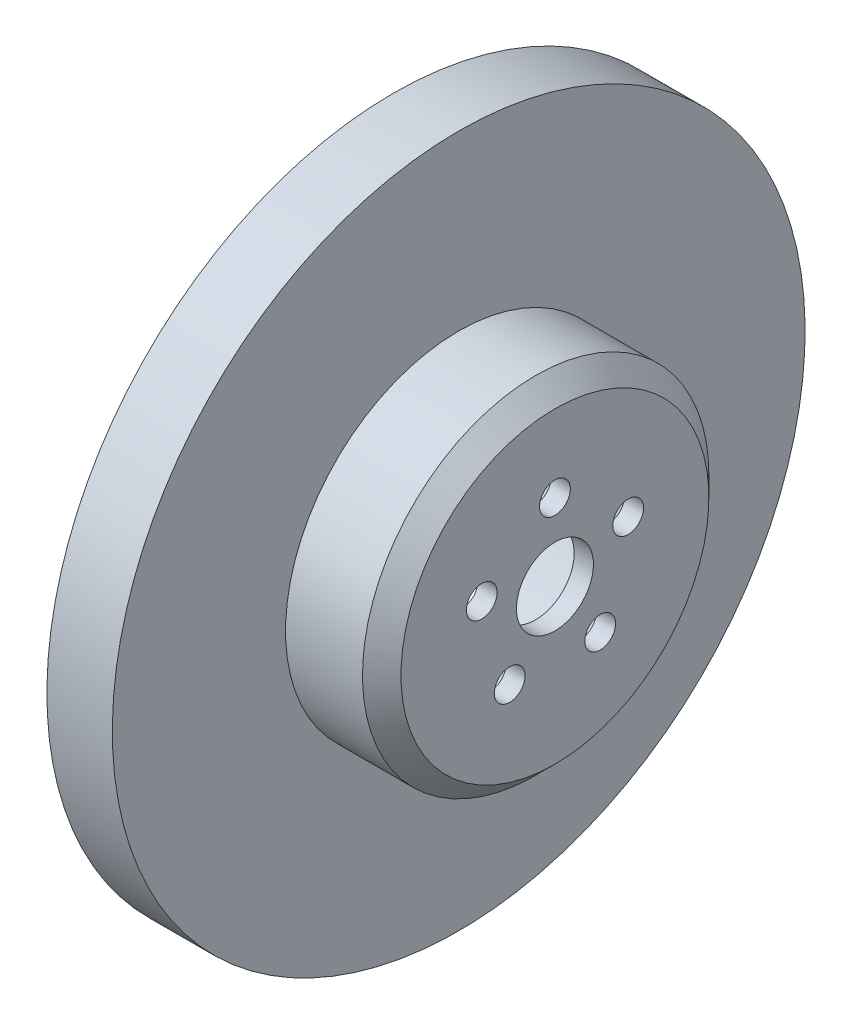
ISO-10303-21;
HEADER;
FILE_DESCRIPTION(('STEP AP214'),'2;1');
FILE_NAME('part.step','',(''),(''),'','','');
FILE_SCHEMA(('AUTOMOTIVE_DESIGN { 1 0 10303 214 1 1 1 1 }'));
ENDSEC;
DATA;
#1=APPLICATION_CONTEXT('core data for automotive mechanical design processes');
#2=APPLICATION_PROTOCOL_DEFINITION('international standard','automotive_design',2000,#1);
#3=PRODUCT_CONTEXT('',#1,'mechanical');
#4=PRODUCT('Part','Part','',(#3));
#5=PRODUCT_RELATED_PRODUCT_CATEGORY('part','',(#4));
#6=PRODUCT_DEFINITION_FORMATION('','',#4);
#7=PRODUCT_DEFINITION_CONTEXT('part definition',#1,'design');
#8=PRODUCT_DEFINITION('design','',#6,#7);
#9=PRODUCT_DEFINITION_SHAPE('','',#8);
#10=(LENGTH_UNIT() NAMED_UNIT(*) SI_UNIT(.MILLI.,.METRE.));
#11=(NAMED_UNIT(*) PLANE_ANGLE_UNIT() SI_UNIT($,.RADIAN.));
#12=(NAMED_UNIT(*) SI_UNIT($,.STERADIAN.) SOLID_ANGLE_UNIT());
#13=UNCERTAINTY_MEASURE_WITH_UNIT(LENGTH_MEASURE(1.E-05),#10,'distance_accuracy_value','');
#14=(GEOMETRIC_REPRESENTATION_CONTEXT(3) GLOBAL_UNCERTAINTY_ASSIGNED_CONTEXT((#13)) GLOBAL_UNIT_ASSIGNED_CONTEXT((#10,
#11,#12)) REPRESENTATION_CONTEXT('',''));
#15=CARTESIAN_POINT('',(0.,0.,0.));
#16=DIRECTION('',(0.,0.,1.));
#17=DIRECTION('',(1.,0.,0.));
#18=AXIS2_PLACEMENT_3D('',#15,#16,#17);
#19=CARTESIAN_POINT('',(50.,-20.,0.));
#20=DIRECTION('',(1.,0.,0.));
#21=DIRECTION('',(0.,1.,0.));
#22=AXIS2_PLACEMENT_3D('',#19,#20,#21);
#23=CYLINDRICAL_SURFACE('',#22,20.);
#24=CARTESIAN_POINT('',(0.,-20.,0.));
#25=DIRECTION('',(1.,0.,0.));
#26=DIRECTION('',(0.,1.,0.));
#27=AXIS2_PLACEMENT_3D('',#24,#25,#26);
#28=CIRCLE('',#27,20.);
#29=CARTESIAN_POINT('',(0.,0.,0.));
#30=VERTEX_POINT('',#29);
#31=EDGE_CURVE('E42',#30,#30,#28,.T.);
#32=ORIENTED_EDGE('',*,*,#31,.T.);
#33=EDGE_LOOP('',(#32));
#34=FACE_BOUND('',#33,.T.);
#35=CARTESIAN_POINT('',(-10.,-20.,0.));
#36=DIRECTION('',(1.,0.,0.));
#37=DIRECTION('',(0.,1.,0.));
#38=AXIS2_PLACEMENT_3D('',#35,#36,#37);
#39=CIRCLE('',#38,20.);
#40=CARTESIAN_POINT('',(-10.,0.,0.));
#41=VERTEX_POINT('',#40);
#42=EDGE_CURVE('E68',#41,#41,#39,.T.);
#43=ORIENTED_EDGE('',*,*,#42,.F.);
#44=EDGE_LOOP('',(#43));
#45=FACE_BOUND('',#44,.T.);
#46=ADVANCED_FACE('F31',(#34,#45),#23,.F.);
#47=CARTESIAN_POINT('',(0.,0.,0.));
#48=DIRECTION('',(1.,0.,0.));
#49=DIRECTION('',(0.,1.,0.));
#50=AXIS2_PLACEMENT_3D('',#47,#48,#49);
#51=PLANE('',#50);
#52=CARTESIAN_POINT('',(0.,-20.,0.));
#53=DIRECTION('',(1.,0.,0.));
#54=DIRECTION('',(0.,1.,0.));
#55=AXIS2_PLACEMENT_3D('',#52,#53,#54);
#56=CIRCLE('',#55,80.0000000000001);
#57=CARTESIAN_POINT('',(0.,60.0000000000001,0.));
#58=VERTEX_POINT('',#57);
#59=EDGE_CURVE('E38',#58,#58,#56,.T.);
#60=ORIENTED_EDGE('',*,*,#59,.T.);
#61=EDGE_LOOP('',(#60));
#62=FACE_BOUND('',#61,.T.);
#63=CARTESIAN_POINT('',(0.,-7.63932022500167,-38.042260651806));
#64=DIRECTION('',(1.,0.,0.));
#65=DIRECTION('',(0.,0.309016994374958,-0.95105651629515));
#66=AXIS2_PLACEMENT_3D('',#63,#64,#65);
#67=CIRCLE('',#66,8.);
#68=CARTESIAN_POINT('',(0.,-5.16718427000201,-45.6507127821672));
#69=VERTEX_POINT('',#68);
#70=EDGE_CURVE('E53',#69,#69,#67,.T.);
#71=ORIENTED_EDGE('',*,*,#70,.F.);
#72=EDGE_LOOP('',(#71));
#73=FACE_BOUND('',#72,.T.);
#74=CARTESIAN_POINT('',(0.,-52.3606797749977,-23.5114100916992));
#75=DIRECTION('',(1.,0.,0.));
#76=DIRECTION('',(0.,-0.809016994374942,-0.58778525229248));
#77=AXIS2_PLACEMENT_3D('',#74,#75,#76);
#78=CIRCLE('',#77,8.);
#79=CARTESIAN_POINT('',(0.,-58.8328157299972,-28.2136921100391));
#80=VERTEX_POINT('',#79);
#81=EDGE_CURVE('E52',#80,#80,#78,.T.);
#82=ORIENTED_EDGE('',*,*,#81,.F.);
#83=EDGE_LOOP('',(#82));
#84=FACE_BOUND('',#83,.T.);
#85=CARTESIAN_POINT('',(0.,-52.360679774998,23.5114100916987));
#86=DIRECTION('',(1.,0.,0.));
#87=DIRECTION('',(0.,-0.809016994374951,0.587785252292469));
#88=AXIS2_PLACEMENT_3D('',#85,#86,#87);
#89=CIRCLE('',#88,8.);
#90=CARTESIAN_POINT('',(0.,-58.8328157299976,28.2136921100385));
#91=VERTEX_POINT('',#90);
#92=EDGE_CURVE('E57',#91,#91,#89,.T.);
#93=ORIENTED_EDGE('',*,*,#92,.F.);
#94=EDGE_LOOP('',(#93));
#95=FACE_BOUND('',#94,.T.);
#96=CARTESIAN_POINT('',(0.,-7.63932022500221,38.0422606518062));
#97=DIRECTION('',(1.,0.,0.));
#98=DIRECTION('',(0.,0.309016994374945,0.951056516295155));
#99=AXIS2_PLACEMENT_3D('',#96,#97,#98);
#100=CIRCLE('',#99,8.);
#101=CARTESIAN_POINT('',(0.,-5.16718427000266,45.6507127821674));
#102=VERTEX_POINT('',#101);
#103=EDGE_CURVE('E61',#102,#102,#100,.T.);
#104=ORIENTED_EDGE('',*,*,#103,.F.);
#105=EDGE_LOOP('',(#104));
#106=FACE_BOUND('',#105,.T.);
#107=CARTESIAN_POINT('',(0.,20.,0.));
#108=DIRECTION('',(1.,0.,0.));
#109=DIRECTION('',(0.,1.,0.));
#110=AXIS2_PLACEMENT_3D('',#107,#108,#109);
#111=CIRCLE('',#110,8.);
#112=CARTESIAN_POINT('',(0.,28.,0.));
#113=VERTEX_POINT('',#112);
#114=EDGE_CURVE('E65',#113,#113,#111,.T.);
#115=ORIENTED_EDGE('',*,*,#114,.F.);
#116=EDGE_LOOP('',(#115));
#117=FACE_BOUND('',#116,.T.);
#118=ORIENTED_EDGE('',*,*,#31,.F.);
#119=EDGE_LOOP('',(#118));
#120=FACE_BOUND('',#119,.T.);
#121=ADVANCED_FACE('F99',(#62,#73,#84,#95,#106,#117,#120),#51,.T.);
#122=CARTESIAN_POINT('',(50.,-20.,0.));
#123=DIRECTION('',(1.,0.,0.));
#124=DIRECTION('',(0.,1.,0.));
#125=AXIS2_PLACEMENT_3D('',#122,#123,#124);
#126=CYLINDRICAL_SURFACE('',#125,90.);
#127=CARTESIAN_POINT('',(-9.99999999999998,-20.,0.));
#128=DIRECTION('',(1.,0.,0.));
#129=DIRECTION('',(0.,0.,-1.));
#130=AXIS2_PLACEMENT_3D('',#127,#128,#129);
#131=CIRCLE('',#130,90.);
#132=CARTESIAN_POINT('',(-9.99999999999998,-20.,-90.));
#133=VERTEX_POINT('',#132);
#134=EDGE_CURVE('E10',#133,#133,#131,.F.);
#135=ORIENTED_EDGE('',*,*,#134,.T.);
#136=EDGE_LOOP('',(#135));
#137=FACE_BOUND('',#136,.T.);
#138=CARTESIAN_POINT('',(-50.,-20.,0.));
#139=DIRECTION('',(1.,0.,0.));
#140=DIRECTION('',(0.,1.,0.));
#141=AXIS2_PLACEMENT_3D('',#138,#139,#140);
#142=CIRCLE('',#141,90.);
#143=CARTESIAN_POINT('',(-50.,70.,0.));
#144=VERTEX_POINT('',#143);
#145=EDGE_CURVE('E46',#144,#144,#142,.T.);
#146=ORIENTED_EDGE('',*,*,#145,.T.);
#147=EDGE_LOOP('',(#146));
#148=FACE_BOUND('',#147,.T.);
#149=ADVANCED_FACE('F102',(#137,#148),#126,.T.);
#150=CARTESIAN_POINT('',(-50.,70.,0.));
#151=DIRECTION('',(1.,0.,0.));
#152=DIRECTION('',(0.,1.,0.));
#153=AXIS2_PLACEMENT_3D('',#150,#151,#152);
#154=PLANE('',#153);
#155=CARTESIAN_POINT('',(-50.,-20.,0.));
#156=DIRECTION('',(1.,0.,0.));
#157=DIRECTION('',(0.,1.,0.));
#158=AXIS2_PLACEMENT_3D('',#155,#156,#157);
#159=CIRCLE('',#158,180.);
#160=CARTESIAN_POINT('',(-50.,160.,0.));
#161=VERTEX_POINT('',#160);
#162=EDGE_CURVE('E72',#161,#161,#159,.T.);
#163=ORIENTED_EDGE('',*,*,#162,.T.);
#164=EDGE_LOOP('',(#163));
#165=FACE_BOUND('',#164,.T.);
#166=ORIENTED_EDGE('',*,*,#145,.F.);
#167=EDGE_LOOP('',(#166));
#168=FACE_BOUND('',#167,.T.);
#169=ADVANCED_FACE('F141',(#165,#168),#154,.T.);
#170=CARTESIAN_POINT('',(50.,-20.,0.));
#171=DIRECTION('',(1.,0.,0.));
#172=DIRECTION('',(0.,1.,0.));
#173=AXIS2_PLACEMENT_3D('',#170,#171,#172);
#174=CYLINDRICAL_SURFACE('',#173,180.);
#175=CARTESIAN_POINT('',(-84.,-20.,0.));
#176=DIRECTION('',(1.,0.,0.));
#177=DIRECTION('',(0.,1.,0.));
#178=AXIS2_PLACEMENT_3D('',#175,#176,#177);
#179=CIRCLE('',#178,180.);
#180=CARTESIAN_POINT('',(-84.,160.,0.));
#181=VERTEX_POINT('',#180);
#182=EDGE_CURVE('E75',#181,#181,#179,.T.);
#183=ORIENTED_EDGE('',*,*,#182,.T.);
#184=EDGE_LOOP('',(#183));
#185=FACE_BOUND('',#184,.T.);
#186=ORIENTED_EDGE('',*,*,#162,.F.);
#187=EDGE_LOOP('',(#186));
#188=FACE_BOUND('',#187,.T.);
#189=ADVANCED_FACE('F135',(#185,#188),#174,.T.);
#190=CARTESIAN_POINT('',(-84.,160.,0.));
#191=DIRECTION('',(-1.,0.,0.));
#192=DIRECTION('',(0.,-1.,0.));
#193=AXIS2_PLACEMENT_3D('',#190,#191,#192);
#194=PLANE('',#193);
#195=CARTESIAN_POINT('',(-84.,-20.,0.));
#196=DIRECTION('',(1.,0.,0.));
#197=DIRECTION('',(0.,1.,0.));
#198=AXIS2_PLACEMENT_3D('',#195,#196,#197);
#199=CIRCLE('',#198,80.);
#200=CARTESIAN_POINT('',(-84.,60.,0.));
#201=VERTEX_POINT('',#200);
#202=EDGE_CURVE('E78',#201,#201,#199,.T.);
#203=ORIENTED_EDGE('',*,*,#202,.T.);
#204=EDGE_LOOP('',(#203));
#205=FACE_BOUND('',#204,.T.);
#206=ORIENTED_EDGE('',*,*,#182,.F.);
#207=EDGE_LOOP('',(#206));
#208=FACE_BOUND('',#207,.T.);
#209=ADVANCED_FACE('F129',(#205,#208),#194,.T.);
#210=CARTESIAN_POINT('',(50.,-20.,0.));
#211=DIRECTION('',(1.,0.,0.));
#212=DIRECTION('',(0.,1.,0.));
#213=AXIS2_PLACEMENT_3D('',#210,#211,#212);
#214=CYLINDRICAL_SURFACE('',#213,80.);
#215=CARTESIAN_POINT('',(-10.,-20.,0.));
#216=DIRECTION('',(1.,0.,0.));
#217=DIRECTION('',(0.,1.,0.));
#218=AXIS2_PLACEMENT_3D('',#215,#216,#217);
#219=CIRCLE('',#218,80.);
#220=CARTESIAN_POINT('',(-10.,60.,0.));
#221=VERTEX_POINT('',#220);
#222=EDGE_CURVE('E81',#221,#221,#219,.T.);
#223=ORIENTED_EDGE('',*,*,#222,.T.);
#224=EDGE_LOOP('',(#223));
#225=FACE_BOUND('',#224,.T.);
#226=ORIENTED_EDGE('',*,*,#202,.F.);
#227=EDGE_LOOP('',(#226));
#228=FACE_BOUND('',#227,.T.);
#229=ADVANCED_FACE('F122',(#225,#228),#214,.F.);
#230=CARTESIAN_POINT('',(-10.,60.,0.));
#231=DIRECTION('',(-1.,0.,0.));
#232=DIRECTION('',(0.,-1.,0.));
#233=AXIS2_PLACEMENT_3D('',#230,#231,#232);
#234=PLANE('',#233);
#235=CARTESIAN_POINT('',(-9.99999999999999,-7.63932022500168,-38.042260651806));
#236=DIRECTION('',(-1.,0.,0.));
#237=DIRECTION('',(0.,-1.,0.));
#238=AXIS2_PLACEMENT_3D('',#235,#236,#237);
#239=CIRCLE('',#238,8.);
#240=CARTESIAN_POINT('',(-9.99999999999999,-15.6393202250017,-38.042260651806));
#241=VERTEX_POINT('',#240);
#242=EDGE_CURVE('E49',#241,#241,#239,.T.);
#243=ORIENTED_EDGE('',*,*,#242,.F.);
#244=EDGE_LOOP('',(#243));
#245=FACE_BOUND('',#244,.T.);
#246=CARTESIAN_POINT('',(-9.99999999999999,-52.3606797749977,-23.5114100916992));
#247=DIRECTION('',(-1.,0.,0.));
#248=DIRECTION('',(0.,-1.,0.));
#249=AXIS2_PLACEMENT_3D('',#246,#247,#248);
#250=CIRCLE('',#249,8.);
#251=CARTESIAN_POINT('',(-9.99999999999999,-60.3606797749977,-23.5114100916992));
#252=VERTEX_POINT('',#251);
#253=EDGE_CURVE('E54',#252,#252,#250,.T.);
#254=ORIENTED_EDGE('',*,*,#253,.F.);
#255=EDGE_LOOP('',(#254));
#256=FACE_BOUND('',#255,.T.);
#257=CARTESIAN_POINT('',(-9.99999999999999,-52.360679774998,23.5114100916987));
#258=DIRECTION('',(-1.,0.,0.));
#259=DIRECTION('',(0.,-1.,0.));
#260=AXIS2_PLACEMENT_3D('',#257,#258,#259);
#261=CIRCLE('',#260,8.);
#262=CARTESIAN_POINT('',(-9.99999999999999,-60.360679774998,23.5114100916987));
#263=VERTEX_POINT('',#262);
#264=EDGE_CURVE('E58',#263,#263,#261,.T.);
#265=ORIENTED_EDGE('',*,*,#264,.F.);
#266=EDGE_LOOP('',(#265));
#267=FACE_BOUND('',#266,.T.);
#268=CARTESIAN_POINT('',(-9.99999999999999,-7.63932022500222,38.0422606518062));
#269=DIRECTION('',(-1.,0.,0.));
#270=DIRECTION('',(0.,-1.,0.));
#271=AXIS2_PLACEMENT_3D('',#268,#269,#270);
#272=CIRCLE('',#271,8.);
#273=CARTESIAN_POINT('',(-9.99999999999999,-15.6393202250022,38.0422606518062));
#274=VERTEX_POINT('',#273);
#275=EDGE_CURVE('E62',#274,#274,#272,.T.);
#276=ORIENTED_EDGE('',*,*,#275,.F.);
#277=EDGE_LOOP('',(#276));
#278=FACE_BOUND('',#277,.T.);
#279=CARTESIAN_POINT('',(-10.,20.,0.));
#280=DIRECTION('',(-1.,0.,0.));
#281=DIRECTION('',(0.,-1.,0.));
#282=AXIS2_PLACEMENT_3D('',#279,#280,#281);
#283=CIRCLE('',#282,8.);
#284=CARTESIAN_POINT('',(-10.,12.,0.));
#285=VERTEX_POINT('',#284);
#286=EDGE_CURVE('E66',#285,#285,#283,.T.);
#287=ORIENTED_EDGE('',*,*,#286,.F.);
#288=EDGE_LOOP('',(#287));
#289=FACE_BOUND('',#288,.T.);
#290=ORIENTED_EDGE('',*,*,#42,.T.);
#291=EDGE_LOOP('',(#290));
#292=FACE_BOUND('',#291,.T.);
#293=ORIENTED_EDGE('',*,*,#222,.F.);
#294=EDGE_LOOP('',(#293));
#295=FACE_BOUND('',#294,.T.);
#296=ADVANCED_FACE('F118',(#245,#256,#267,#278,#289,#292,#295),#234,.T.);
#297=CARTESIAN_POINT('',(-84.,20.,0.));
#298=DIRECTION('',(1.,0.,0.));
#299=DIRECTION('',(0.,1.,0.));
#300=AXIS2_PLACEMENT_3D('',#297,#298,#299);
#301=CYLINDRICAL_SURFACE('',#300,8.);
#302=ORIENTED_EDGE('',*,*,#286,.T.);
#303=EDGE_LOOP('',(#302));
#304=FACE_BOUND('',#303,.T.);
#305=ORIENTED_EDGE('',*,*,#114,.T.);
#306=EDGE_LOOP('',(#305));
#307=FACE_BOUND('',#306,.T.);
#308=ADVANCED_FACE('F121',(#304,#307),#301,.F.);
#309=CARTESIAN_POINT('',(-84.,-7.63932022500223,38.0422606518062));
#310=DIRECTION('',(1.,0.,0.));
#311=DIRECTION('',(0.,1.,0.));
#312=AXIS2_PLACEMENT_3D('',#309,#310,#311);
#313=CYLINDRICAL_SURFACE('',#312,8.);
#314=ORIENTED_EDGE('',*,*,#275,.T.);
#315=EDGE_LOOP('',(#314));
#316=FACE_BOUND('',#315,.T.);
#317=ORIENTED_EDGE('',*,*,#103,.T.);
#318=EDGE_LOOP('',(#317));
#319=FACE_BOUND('',#318,.T.);
#320=ADVANCED_FACE('F157',(#316,#319),#313,.F.);
#321=CARTESIAN_POINT('',(-84.,-52.3606797749981,23.5114100916987));
#322=DIRECTION('',(1.,0.,0.));
#323=DIRECTION('',(0.,1.,0.));
#324=AXIS2_PLACEMENT_3D('',#321,#322,#323);
#325=CYLINDRICAL_SURFACE('',#324,8.);
#326=ORIENTED_EDGE('',*,*,#264,.T.);
#327=EDGE_LOOP('',(#326));
#328=FACE_BOUND('',#327,.T.);
#329=ORIENTED_EDGE('',*,*,#92,.T.);
#330=EDGE_LOOP('',(#329));
#331=FACE_BOUND('',#330,.T.);
#332=ADVANCED_FACE('F161',(#328,#331),#325,.F.);
#333=CARTESIAN_POINT('',(-84.,-52.3606797749977,-23.5114100916992));
#334=DIRECTION('',(1.,0.,0.));
#335=DIRECTION('',(0.,1.,0.));
#336=AXIS2_PLACEMENT_3D('',#333,#334,#335);
#337=CYLINDRICAL_SURFACE('',#336,8.);
#338=ORIENTED_EDGE('',*,*,#253,.T.);
#339=EDGE_LOOP('',(#338));
#340=FACE_BOUND('',#339,.T.);
#341=ORIENTED_EDGE('',*,*,#81,.T.);
#342=EDGE_LOOP('',(#341));
#343=FACE_BOUND('',#342,.T.);
#344=ADVANCED_FACE('F165',(#340,#343),#337,.F.);
#345=CARTESIAN_POINT('',(-84.,-7.63932022500169,-38.042260651806));
#346=DIRECTION('',(1.,0.,0.));
#347=DIRECTION('',(0.,1.,0.));
#348=AXIS2_PLACEMENT_3D('',#345,#346,#347);
#349=CYLINDRICAL_SURFACE('',#348,8.);
#350=ORIENTED_EDGE('',*,*,#242,.T.);
#351=EDGE_LOOP('',(#350));
#352=FACE_BOUND('',#351,.T.);
#353=ORIENTED_EDGE('',*,*,#70,.T.);
#354=EDGE_LOOP('',(#353));
#355=FACE_BOUND('',#354,.T.);
#356=ADVANCED_FACE('F97',(#352,#355),#349,.F.);
#357=CARTESIAN_POINT('',(0.,-20.,0.));
#358=DIRECTION('',(-1.,0.,0.));
#359=DIRECTION('',(0.,0.,1.));
#360=AXIS2_PLACEMENT_3D('',#357,#358,#359);
#361=CONICAL_SURFACE('',#360,80.0000000000001,0.785398163397445);
#362=ORIENTED_EDGE('',*,*,#134,.F.);
#363=EDGE_LOOP('',(#362));
#364=FACE_BOUND('',#363,.T.);
#365=ORIENTED_EDGE('',*,*,#59,.F.);
#366=EDGE_LOOP('',(#365));
#367=FACE_BOUND('',#366,.T.);
#368=ADVANCED_FACE('F33',(#364,#367),#361,.T.);
#369=CLOSED_SHELL('',(#46,#121,#149,#169,#189,#209,#229,#296,#308,#320,#332,#344,#356,#368));
#370=MANIFOLD_SOLID_BREP('B2',#369);
#371=ADVANCED_BREP_SHAPE_REPRESENTATION('',(#18,#370),#14);
#372=SHAPE_DEFINITION_REPRESENTATION(#9,#371);
ENDSEC;
END-ISO-10303-21;
